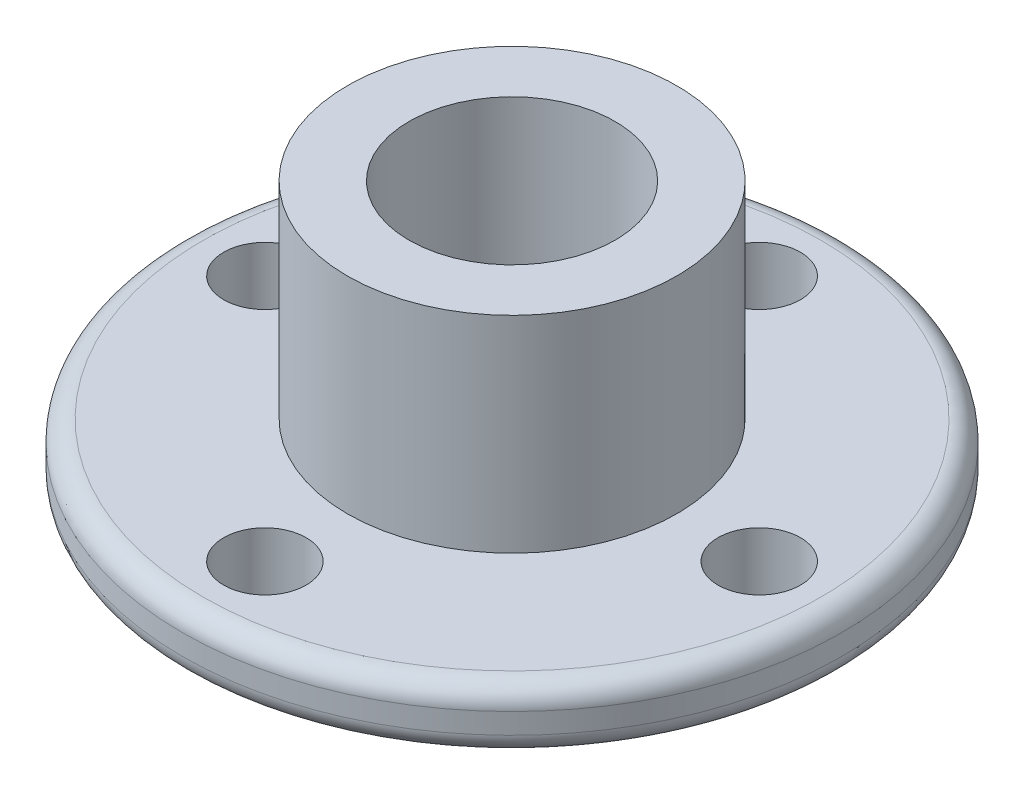
ISO-10303-21;
HEADER;
FILE_DESCRIPTION(('STEP AP214'),'2;1');
FILE_NAME('part.step','',(''),(''),'','','');
FILE_SCHEMA(('AUTOMOTIVE_DESIGN { 1 0 10303 214 1 1 1 1 }'));
ENDSEC;
DATA;
#1=APPLICATION_CONTEXT('core data for automotive mechanical design processes');
#2=APPLICATION_PROTOCOL_DEFINITION('international standard','automotive_design',2000,#1);
#3=PRODUCT_CONTEXT('',#1,'mechanical');
#4=PRODUCT('Part','Part','',(#3));
#5=PRODUCT_RELATED_PRODUCT_CATEGORY('part','',(#4));
#6=PRODUCT_DEFINITION_FORMATION('','',#4);
#7=PRODUCT_DEFINITION_CONTEXT('part definition',#1,'design');
#8=PRODUCT_DEFINITION('design','',#6,#7);
#9=PRODUCT_DEFINITION_SHAPE('','',#8);
#10=(LENGTH_UNIT() NAMED_UNIT(*) SI_UNIT(.MILLI.,.METRE.));
#11=(NAMED_UNIT(*) PLANE_ANGLE_UNIT() SI_UNIT($,.RADIAN.));
#12=(NAMED_UNIT(*) SI_UNIT($,.STERADIAN.) SOLID_ANGLE_UNIT());
#13=UNCERTAINTY_MEASURE_WITH_UNIT(LENGTH_MEASURE(1.E-05),#10,'distance_accuracy_value','');
#14=(GEOMETRIC_REPRESENTATION_CONTEXT(3) GLOBAL_UNCERTAINTY_ASSIGNED_CONTEXT((#13)) GLOBAL_UNIT_ASSIGNED_CONTEXT((#10,
#11,#12)) REPRESENTATION_CONTEXT('',''));
#15=CARTESIAN_POINT('',(0.,0.,0.));
#16=DIRECTION('',(0.,0.,1.));
#17=DIRECTION('',(1.,0.,0.));
#18=AXIS2_PLACEMENT_3D('',#15,#16,#17);
#19=CARTESIAN_POINT('',(0.,3.,0.));
#20=DIRECTION('',(0.,1.,0.));
#21=DIRECTION('',(0.,0.,1.));
#22=AXIS2_PLACEMENT_3D('',#19,#20,#21);
#23=PLANE('',#22);
#24=CARTESIAN_POINT('',(0.,3.,0.));
#25=DIRECTION('',(0.,1.,0.));
#26=DIRECTION('',(0.,0.,1.));
#27=AXIS2_PLACEMENT_3D('',#24,#25,#26);
#28=CIRCLE('',#27,15.);
#29=CARTESIAN_POINT('',(0.,3.,15.));
#30=VERTEX_POINT('',#29);
#31=EDGE_CURVE('E10',#30,#30,#28,.T.);
#32=ORIENTED_EDGE('',*,*,#31,.T.);
#33=EDGE_LOOP('',(#32));
#34=FACE_BOUND('',#33,.T.);
#35=CARTESIAN_POINT('',(12.,3.,0.));
#36=DIRECTION('',(0.,1.,0.));
#37=DIRECTION('',(0.,0.,1.));
#38=AXIS2_PLACEMENT_3D('',#35,#36,#37);
#39=CIRCLE('',#38,2.00000000000004);
#40=CARTESIAN_POINT('',(12.,3.,2.00000000000004));
#41=VERTEX_POINT('',#40);
#42=EDGE_CURVE('E56',#41,#41,#39,.T.);
#43=ORIENTED_EDGE('',*,*,#42,.F.);
#44=EDGE_LOOP('',(#43));
#45=FACE_BOUND('',#44,.T.);
#46=CARTESIAN_POINT('',(0.,3.,12.));
#47=DIRECTION('',(0.,1.,0.));
#48=DIRECTION('',(0.,0.,1.));
#49=AXIS2_PLACEMENT_3D('',#46,#47,#48);
#50=CIRCLE('',#49,2.);
#51=CARTESIAN_POINT('',(0.,3.,14.));
#52=VERTEX_POINT('',#51);
#53=EDGE_CURVE('E74',#52,#52,#50,.T.);
#54=ORIENTED_EDGE('',*,*,#53,.F.);
#55=EDGE_LOOP('',(#54));
#56=FACE_BOUND('',#55,.T.);
#57=CARTESIAN_POINT('',(-12.,3.,0.));
#58=DIRECTION('',(0.,1.,0.));
#59=DIRECTION('',(0.,0.,1.));
#60=AXIS2_PLACEMENT_3D('',#57,#58,#59);
#61=CIRCLE('',#60,2.);
#62=CARTESIAN_POINT('',(-12.,3.,2.));
#63=VERTEX_POINT('',#62);
#64=EDGE_CURVE('E67',#63,#63,#61,.T.);
#65=ORIENTED_EDGE('',*,*,#64,.F.);
#66=EDGE_LOOP('',(#65));
#67=FACE_BOUND('',#66,.T.);
#68=CARTESIAN_POINT('',(0.,3.,-12.));
#69=DIRECTION('',(0.,1.,0.));
#70=DIRECTION('',(0.,0.,1.));
#71=AXIS2_PLACEMENT_3D('',#68,#69,#70);
#72=CIRCLE('',#71,2.);
#73=CARTESIAN_POINT('',(0.,3.,-10.));
#74=VERTEX_POINT('',#73);
#75=EDGE_CURVE('E66',#74,#74,#72,.T.);
#76=ORIENTED_EDGE('',*,*,#75,.F.);
#77=EDGE_LOOP('',(#76));
#78=FACE_BOUND('',#77,.T.);
#79=CARTESIAN_POINT('',(0.,3.,0.));
#80=DIRECTION('',(0.,1.,0.));
#81=DIRECTION('',(0.,0.,1.));
#82=AXIS2_PLACEMENT_3D('',#79,#80,#81);
#83=CIRCLE('',#82,8.);
#84=CARTESIAN_POINT('',(0.,3.,8.));
#85=VERTEX_POINT('',#84);
#86=EDGE_CURVE('E83',#85,#85,#83,.T.);
#87=ORIENTED_EDGE('',*,*,#86,.F.);
#88=EDGE_LOOP('',(#87));
#89=FACE_BOUND('',#88,.T.);
#90=ADVANCED_FACE('F35',(#34,#45,#56,#67,#78,#89),#23,.T.);
#91=CARTESIAN_POINT('',(0.,3.,0.));
#92=DIRECTION('',(0.,-1.,0.));
#93=DIRECTION('',(0.,0.,-1.));
#94=AXIS2_PLACEMENT_3D('',#91,#92,#93);
#95=CYLINDRICAL_SURFACE('',#94,16.);
#96=CARTESIAN_POINT('',(0.,1.,0.));
#97=DIRECTION('',(0.,1.,0.));
#98=DIRECTION('',(0.,0.,1.));
#99=AXIS2_PLACEMENT_3D('',#96,#97,#98);
#100=CIRCLE('',#99,16.);
#101=CARTESIAN_POINT('',(0.,1.,16.));
#102=VERTEX_POINT('',#101);
#103=EDGE_CURVE('E46',#102,#102,#100,.T.);
#104=ORIENTED_EDGE('',*,*,#103,.T.);
#105=EDGE_LOOP('',(#104));
#106=FACE_BOUND('',#105,.T.);
#107=CARTESIAN_POINT('',(0.,2.,0.));
#108=DIRECTION('',(0.,1.,0.));
#109=DIRECTION('',(0.,0.,1.));
#110=AXIS2_PLACEMENT_3D('',#107,#108,#109);
#111=CIRCLE('',#110,16.);
#112=CARTESIAN_POINT('',(0.,2.,16.));
#113=VERTEX_POINT('',#112);
#114=EDGE_CURVE('E50',#113,#113,#111,.F.);
#115=ORIENTED_EDGE('',*,*,#114,.T.);
#116=EDGE_LOOP('',(#115));
#117=FACE_BOUND('',#116,.T.);
#118=ADVANCED_FACE('F112',(#106,#117),#95,.T.);
#119=CARTESIAN_POINT('',(0.,0.,0.));
#120=DIRECTION('',(0.,1.,0.));
#121=DIRECTION('',(0.,0.,1.));
#122=AXIS2_PLACEMENT_3D('',#119,#120,#121);
#123=PLANE('',#122);
#124=CARTESIAN_POINT('',(0.,0.,0.));
#125=DIRECTION('',(0.,1.,0.));
#126=DIRECTION('',(0.,0.,1.));
#127=AXIS2_PLACEMENT_3D('',#124,#125,#126);
#128=CIRCLE('',#127,15.);
#129=CARTESIAN_POINT('',(0.,0.,15.));
#130=VERTEX_POINT('',#129);
#131=EDGE_CURVE('E42',#130,#130,#128,.F.);
#132=ORIENTED_EDGE('',*,*,#131,.T.);
#133=EDGE_LOOP('',(#132));
#134=FACE_BOUND('',#133,.T.);
#135=CARTESIAN_POINT('',(0.,0.,-12.));
#136=DIRECTION('',(0.,1.,0.));
#137=DIRECTION('',(0.,0.,1.));
#138=AXIS2_PLACEMENT_3D('',#135,#136,#137);
#139=CIRCLE('',#138,2.);
#140=CARTESIAN_POINT('',(0.,0.,-10.));
#141=VERTEX_POINT('',#140);
#142=EDGE_CURVE('E55',#141,#141,#139,.T.);
#143=ORIENTED_EDGE('',*,*,#142,.T.);
#144=EDGE_LOOP('',(#143));
#145=FACE_BOUND('',#144,.T.);
#146=CARTESIAN_POINT('',(-12.,0.,0.));
#147=DIRECTION('',(0.,1.,0.));
#148=DIRECTION('',(0.,0.,1.));
#149=AXIS2_PLACEMENT_3D('',#146,#147,#148);
#150=CIRCLE('',#149,2.);
#151=CARTESIAN_POINT('',(-12.,0.,2.));
#152=VERTEX_POINT('',#151);
#153=EDGE_CURVE('E70',#152,#152,#150,.T.);
#154=ORIENTED_EDGE('',*,*,#153,.T.);
#155=EDGE_LOOP('',(#154));
#156=FACE_BOUND('',#155,.T.);
#157=CARTESIAN_POINT('',(0.,0.,12.));
#158=DIRECTION('',(0.,1.,0.));
#159=DIRECTION('',(0.,0.,1.));
#160=AXIS2_PLACEMENT_3D('',#157,#158,#159);
#161=CIRCLE('',#160,2.);
#162=CARTESIAN_POINT('',(0.,0.,14.));
#163=VERTEX_POINT('',#162);
#164=EDGE_CURVE('E60',#163,#163,#161,.T.);
#165=ORIENTED_EDGE('',*,*,#164,.T.);
#166=EDGE_LOOP('',(#165));
#167=FACE_BOUND('',#166,.T.);
#168=CARTESIAN_POINT('',(12.,0.,0.));
#169=DIRECTION('',(0.,1.,0.));
#170=DIRECTION('',(0.,0.,1.));
#171=AXIS2_PLACEMENT_3D('',#168,#169,#170);
#172=CIRCLE('',#171,2.00000000000004);
#173=CARTESIAN_POINT('',(12.,0.,2.00000000000004));
#174=VERTEX_POINT('',#173);
#175=EDGE_CURVE('E59',#174,#174,#172,.T.);
#176=ORIENTED_EDGE('',*,*,#175,.T.);
#177=EDGE_LOOP('',(#176));
#178=FACE_BOUND('',#177,.T.);
#179=CARTESIAN_POINT('',(0.,0.,0.));
#180=DIRECTION('',(0.,1.,0.));
#181=DIRECTION('',(0.,0.,1.));
#182=AXIS2_PLACEMENT_3D('',#179,#180,#181);
#183=CIRCLE('',#182,5.);
#184=CARTESIAN_POINT('',(0.,0.,5.));
#185=VERTEX_POINT('',#184);
#186=EDGE_CURVE('E63',#185,#185,#183,.T.);
#187=ORIENTED_EDGE('',*,*,#186,.T.);
#188=EDGE_LOOP('',(#187));
#189=FACE_BOUND('',#188,.T.);
#190=ADVANCED_FACE('F117',(#134,#145,#156,#167,#178,#189),#123,.F.);
#191=CARTESIAN_POINT('',(0.,0.,0.));
#192=DIRECTION('',(0.,1.,0.));
#193=DIRECTION('',(0.,0.,1.));
#194=AXIS2_PLACEMENT_3D('',#191,#192,#193);
#195=CYLINDRICAL_SURFACE('',#194,5.);
#196=ORIENTED_EDGE('',*,*,#186,.F.);
#197=EDGE_LOOP('',(#196));
#198=FACE_BOUND('',#197,.T.);
#199=CARTESIAN_POINT('',(0.,13.,0.));
#200=DIRECTION('',(0.,1.,0.));
#201=DIRECTION('',(0.,0.,1.));
#202=AXIS2_PLACEMENT_3D('',#199,#200,#201);
#203=CIRCLE('',#202,5.);
#204=CARTESIAN_POINT('',(0.,13.,5.));
#205=VERTEX_POINT('',#204);
#206=EDGE_CURVE('E86',#205,#205,#203,.T.);
#207=ORIENTED_EDGE('',*,*,#206,.T.);
#208=EDGE_LOOP('',(#207));
#209=FACE_BOUND('',#208,.T.);
#210=ADVANCED_FACE('F92',(#198,#209),#195,.F.);
#211=CARTESIAN_POINT('',(12.,0.,0.));
#212=DIRECTION('',(0.,1.,0.));
#213=DIRECTION('',(0.,0.,1.));
#214=AXIS2_PLACEMENT_3D('',#211,#212,#213);
#215=CYLINDRICAL_SURFACE('',#214,2.00000000000004);
#216=ORIENTED_EDGE('',*,*,#175,.F.);
#217=EDGE_LOOP('',(#216));
#218=FACE_BOUND('',#217,.T.);
#219=ORIENTED_EDGE('',*,*,#42,.T.);
#220=EDGE_LOOP('',(#219));
#221=FACE_BOUND('',#220,.T.);
#222=ADVANCED_FACE('F123',(#218,#221),#215,.F.);
#223=CARTESIAN_POINT('',(0.,0.,12.));
#224=DIRECTION('',(0.,1.,0.));
#225=DIRECTION('',(0.,0.,1.));
#226=AXIS2_PLACEMENT_3D('',#223,#224,#225);
#227=CYLINDRICAL_SURFACE('',#226,2.);
#228=ORIENTED_EDGE('',*,*,#164,.F.);
#229=EDGE_LOOP('',(#228));
#230=FACE_BOUND('',#229,.T.);
#231=ORIENTED_EDGE('',*,*,#53,.T.);
#232=EDGE_LOOP('',(#231));
#233=FACE_BOUND('',#232,.T.);
#234=ADVANCED_FACE('F170',(#230,#233),#227,.F.);
#235=CARTESIAN_POINT('',(-12.,0.,0.));
#236=DIRECTION('',(0.,1.,0.));
#237=DIRECTION('',(0.,0.,1.));
#238=AXIS2_PLACEMENT_3D('',#235,#236,#237);
#239=CYLINDRICAL_SURFACE('',#238,2.);
#240=ORIENTED_EDGE('',*,*,#153,.F.);
#241=EDGE_LOOP('',(#240));
#242=FACE_BOUND('',#241,.T.);
#243=ORIENTED_EDGE('',*,*,#64,.T.);
#244=EDGE_LOOP('',(#243));
#245=FACE_BOUND('',#244,.T.);
#246=ADVANCED_FACE('F108',(#242,#245),#239,.F.);
#247=CARTESIAN_POINT('',(0.,0.,-12.));
#248=DIRECTION('',(0.,1.,0.));
#249=DIRECTION('',(0.,0.,1.));
#250=AXIS2_PLACEMENT_3D('',#247,#248,#249);
#251=CYLINDRICAL_SURFACE('',#250,2.);
#252=ORIENTED_EDGE('',*,*,#142,.F.);
#253=EDGE_LOOP('',(#252));
#254=FACE_BOUND('',#253,.T.);
#255=ORIENTED_EDGE('',*,*,#75,.T.);
#256=EDGE_LOOP('',(#255));
#257=FACE_BOUND('',#256,.T.);
#258=ADVANCED_FACE('F97',(#254,#257),#251,.F.);
#259=CARTESIAN_POINT('',(0.,13.,0.));
#260=DIRECTION('',(0.,1.,0.));
#261=DIRECTION('',(0.,0.,1.));
#262=AXIS2_PLACEMENT_3D('',#259,#260,#261);
#263=PLANE('',#262);
#264=CARTESIAN_POINT('',(0.,13.,0.));
#265=DIRECTION('',(0.,1.,0.));
#266=DIRECTION('',(0.,0.,1.));
#267=AXIS2_PLACEMENT_3D('',#264,#265,#266);
#268=CIRCLE('',#267,8.);
#269=CARTESIAN_POINT('',(0.,13.,8.));
#270=VERTEX_POINT('',#269);
#271=EDGE_CURVE('E71',#270,#270,#268,.T.);
#272=ORIENTED_EDGE('',*,*,#271,.T.);
#273=EDGE_LOOP('',(#272));
#274=FACE_BOUND('',#273,.T.);
#275=ORIENTED_EDGE('',*,*,#206,.F.);
#276=EDGE_LOOP('',(#275));
#277=FACE_BOUND('',#276,.T.);
#278=ADVANCED_FACE('F94',(#274,#277),#263,.T.);
#279=CARTESIAN_POINT('',(0.,13.,0.));
#280=DIRECTION('',(0.,-1.,0.));
#281=DIRECTION('',(0.,0.,-1.));
#282=AXIS2_PLACEMENT_3D('',#279,#280,#281);
#283=CYLINDRICAL_SURFACE('',#282,8.);
#284=ORIENTED_EDGE('',*,*,#271,.F.);
#285=EDGE_LOOP('',(#284));
#286=FACE_BOUND('',#285,.T.);
#287=ORIENTED_EDGE('',*,*,#86,.T.);
#288=EDGE_LOOP('',(#287));
#289=FACE_BOUND('',#288,.T.);
#290=ADVANCED_FACE('F96',(#286,#289),#283,.T.);
#291=CARTESIAN_POINT('',(0.,1.,0.));
#292=DIRECTION('',(0.,1.,0.));
#293=DIRECTION('',(0.,0.,1.));
#294=AXIS2_PLACEMENT_3D('',#291,#292,#293);
#295=TOROIDAL_SURFACE('',#294,15.,1.);
#296=ORIENTED_EDGE('',*,*,#131,.F.);
#297=EDGE_LOOP('',(#296));
#298=FACE_BOUND('',#297,.T.);
#299=ORIENTED_EDGE('',*,*,#103,.F.);
#300=EDGE_LOOP('',(#299));
#301=FACE_BOUND('',#300,.T.);
#302=ADVANCED_FACE('F104',(#298,#301),#295,.T.);
#303=CARTESIAN_POINT('',(0.,2.,0.));
#304=DIRECTION('',(0.,1.,0.));
#305=DIRECTION('',(0.,0.,1.));
#306=AXIS2_PLACEMENT_3D('',#303,#304,#305);
#307=TOROIDAL_SURFACE('',#306,15.,1.);
#308=ORIENTED_EDGE('',*,*,#114,.F.);
#309=EDGE_LOOP('',(#308));
#310=FACE_BOUND('',#309,.T.);
#311=ORIENTED_EDGE('',*,*,#31,.F.);
#312=EDGE_LOOP('',(#311));
#313=FACE_BOUND('',#312,.T.);
#314=ADVANCED_FACE('F37',(#310,#313),#307,.T.);
#315=CLOSED_SHELL('',(#90,#118,#190,#210,#222,#234,#246,#258,#278,#290,#302,#314));
#316=MANIFOLD_SOLID_BREP('B2',#315);
#317=ADVANCED_BREP_SHAPE_REPRESENTATION('',(#18,#316),#14);
#318=SHAPE_DEFINITION_REPRESENTATION(#9,#317);
ENDSEC;
END-ISO-10303-21;
